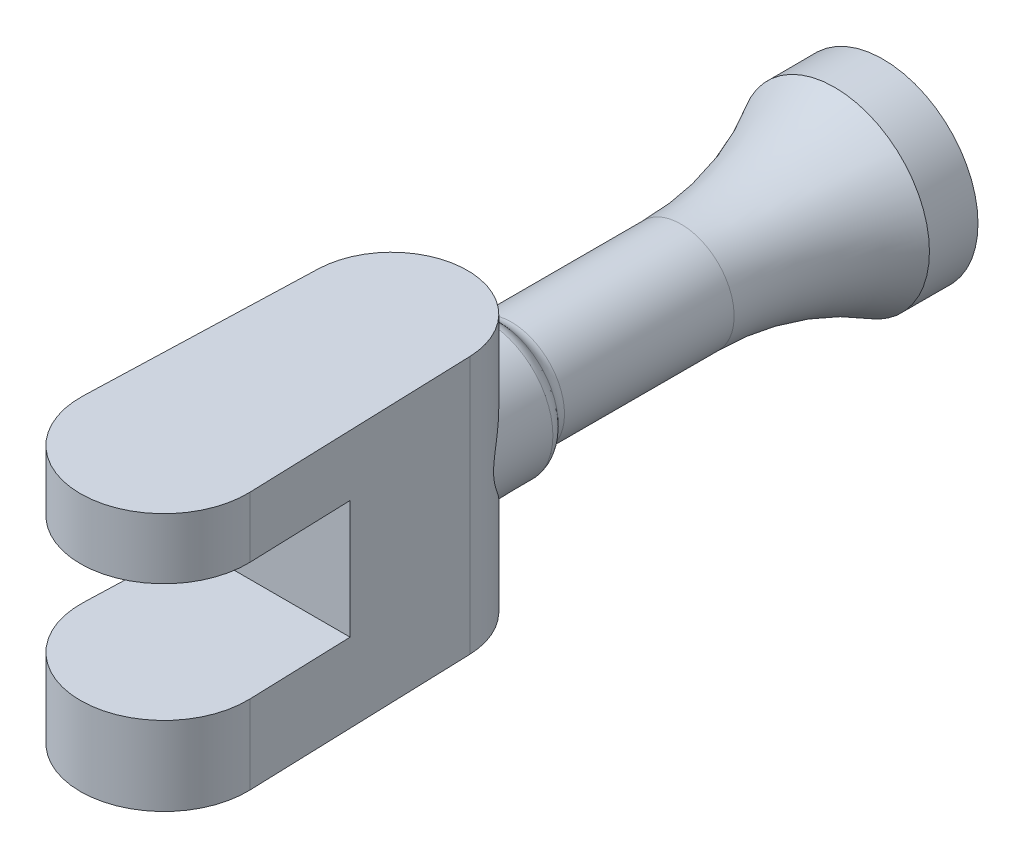
ISO-10303-21;
HEADER;
FILE_DESCRIPTION(('STEP AP214'),'2;1');
FILE_NAME('part.step','',(''),(''),'','','');
FILE_SCHEMA(('AUTOMOTIVE_DESIGN { 1 0 10303 214 1 1 1 1 }'));
ENDSEC;
DATA;
#1=APPLICATION_CONTEXT('core data for automotive mechanical design processes');
#2=APPLICATION_PROTOCOL_DEFINITION('international standard','automotive_design',2000,#1);
#3=PRODUCT_CONTEXT('',#1,'mechanical');
#4=PRODUCT('Part','Part','',(#3));
#5=PRODUCT_RELATED_PRODUCT_CATEGORY('part','',(#4));
#6=PRODUCT_DEFINITION_FORMATION('','',#4);
#7=PRODUCT_DEFINITION_CONTEXT('part definition',#1,'design');
#8=PRODUCT_DEFINITION('design','',#6,#7);
#9=PRODUCT_DEFINITION_SHAPE('','',#8);
#10=(LENGTH_UNIT() NAMED_UNIT(*) SI_UNIT(.MILLI.,.METRE.));
#11=(NAMED_UNIT(*) PLANE_ANGLE_UNIT() SI_UNIT($,.RADIAN.));
#12=(NAMED_UNIT(*) SI_UNIT($,.STERADIAN.) SOLID_ANGLE_UNIT());
#13=UNCERTAINTY_MEASURE_WITH_UNIT(LENGTH_MEASURE(1.E-05),#10,'distance_accuracy_value','');
#14=(GEOMETRIC_REPRESENTATION_CONTEXT(3) GLOBAL_UNCERTAINTY_ASSIGNED_CONTEXT((#13)) GLOBAL_UNIT_ASSIGNED_CONTEXT((#10,
#11,#12)) REPRESENTATION_CONTEXT('',''));
#15=CARTESIAN_POINT('',(0.,0.,0.));
#16=DIRECTION('',(0.,0.,1.));
#17=DIRECTION('',(1.,0.,0.));
#18=AXIS2_PLACEMENT_3D('',#15,#16,#17);
#19=CARTESIAN_POINT('',(0.,79.,474.));
#20=DIRECTION('',(0.,-1.,0.));
#21=DIRECTION('',(0.,0.,-1.));
#22=AXIS2_PLACEMENT_3D('',#19,#20,#21);
#23=CYLINDRICAL_SURFACE('',#22,55.);
#24=DIRECTION('',(0.,-1.,0.));
#25=VECTOR('',#24,1.);
#26=CARTESIAN_POINT('',(54.9694359520715,79.,472.166666666667));
#27=LINE('',#26,#25);
#28=CARTESIAN_POINT('',(54.9694359520715,-39.,472.166666666667));
#29=VERTEX_POINT('',#28);
#30=CARTESIAN_POINT('',(54.9694359520715,-91.,472.166666666667));
#31=VERTEX_POINT('',#30);
#32=EDGE_CURVE('E148',#29,#31,#27,.T.);
#33=ORIENTED_EDGE('',*,*,#32,.F.);
#34=CARTESIAN_POINT('',(0.,-39.,474.));
#35=DIRECTION('',(0.,-1.,0.));
#36=DIRECTION('',(0.,0.,-1.));
#37=AXIS2_PLACEMENT_3D('',#34,#35,#36);
#38=CIRCLE('',#37,55.);
#39=CARTESIAN_POINT('',(-54.9694359520715,-39.,472.166666666667));
#40=VERTEX_POINT('',#39);
#41=EDGE_CURVE('E109',#29,#40,#38,.T.);
#42=ORIENTED_EDGE('',*,*,#41,.T.);
#43=DIRECTION('',(0.,-1.,0.));
#44=VECTOR('',#43,1.);
#45=CARTESIAN_POINT('',(-54.9694359520715,79.,472.166666666667));
#46=LINE('',#45,#44);
#47=CARTESIAN_POINT('',(-54.9694359520715,-91.,472.166666666667));
#48=VERTEX_POINT('',#47);
#49=EDGE_CURVE('E152',#40,#48,#46,.T.);
#50=ORIENTED_EDGE('',*,*,#49,.T.);
#51=CARTESIAN_POINT('',(0.,-91.,474.));
#52=DIRECTION('',(0.,1.,0.));
#53=DIRECTION('',(0.,0.,1.));
#54=AXIS2_PLACEMENT_3D('',#51,#52,#53);
#55=CIRCLE('',#54,55.);
#56=EDGE_CURVE('E133',#48,#31,#55,.T.);
#57=ORIENTED_EDGE('',*,*,#56,.T.);
#58=EDGE_LOOP('',(#33,#42,#50,#57));
#59=FACE_BOUND('',#58,.T.);
#60=ADVANCED_FACE('F32',(#59),#23,.T.);
#61=CARTESIAN_POINT('',(1.11022302462516E-13,0.,266.838213148442));
#62=DIRECTION('',(0.,0.,-1.));
#63=DIRECTION('',(-1.,0.,0.));
#64=AXIS2_PLACEMENT_3D('',#61,#62,#63);
#65=TOROIDAL_SURFACE('',#64,617.119267835692,573.627372225386);
#66=CARTESIAN_POINT('',(0.,0.,261.16));
#67=DIRECTION('',(0.,0.,1.));
#68=DIRECTION('',(1.,0.,0.));
#69=AXIS2_PLACEMENT_3D('',#66,#67,#68);
#70=CIRCLE('',#69,43.52);
#71=CARTESIAN_POINT('',(43.52,0.,261.16));
#72=VERTEX_POINT('',#71);
#73=EDGE_CURVE('E163',#72,#72,#70,.T.);
#74=ORIENTED_EDGE('',*,*,#73,.T.);
#75=EDGE_LOOP('',(#74));
#76=FACE_BOUND('',#75,.T.);
#77=CARTESIAN_POINT('',(-31.4772813356643,-30.434299180226,285.151824242116));
#78=CARTESIAN_POINT('',(-30.673098195026,-31.2360929872093,284.50021634267));
#79=CARTESIAN_POINT('',(-29.8337317977299,-32.0129958438542,283.861479783517));
#80=CARTESIAN_POINT('',(-28.0836932142744,-33.5123703007245,282.618143132112));
#81=CARTESIAN_POINT('',(-27.1730179103238,-34.2348395182718,282.013544534441));
#82=CARTESIAN_POINT('',(-25.2811312214723,-35.6183696170427,280.847966874934));
#83=CARTESIAN_POINT('',(-24.2999776633424,-36.2794798445153,280.286952821671));
#84=CARTESIAN_POINT('',(-22.2676516880738,-37.5331534635026,279.217533750028));
#85=CARTESIAN_POINT('',(-21.2164955240209,-38.1257326795979,278.709116589306));
#86=CARTESIAN_POINT('',(-19.2617488181998,-39.1238802381984,277.849281505185));
#87=CARTESIAN_POINT('',(-18.3700999704709,-39.5432540826555,277.486701507318));
#88=CARTESIAN_POINT('',(-16.5462182032051,-40.3272441296358,276.807104859231));
#89=CARTESIAN_POINT('',(-15.6139895022995,-40.6918660066531,276.490083487462));
#90=CARTESIAN_POINT('',(-13.7132426264031,-41.3611067325228,275.907021911653));
#91=CARTESIAN_POINT('',(-12.7447436049372,-41.6657567338406,275.640955241092));
#92=CARTESIAN_POINT('',(-10.7762212162245,-42.2103873023148,275.164578795654));
#93=CARTESIAN_POINT('',(-9.77619758060166,-42.450367318755,274.954269495595));
#94=CARTESIAN_POINT('',(-7.74430890625304,-42.8627106045592,274.592534007841));
#95=CARTESIAN_POINT('',(-6.71227133746822,-43.0345941783031,274.441525620042));
#96=CARTESIAN_POINT('',(-4.63121564318174,-43.3048777914535,274.203930935176));
#97=CARTESIAN_POINT('',(-3.58219746984117,-43.4032776237998,274.117344819635));
#98=CARTESIAN_POINT('',(-1.47675956819256,-43.5244542375279,274.010702391766));
#99=CARTESIAN_POINT('',(-0.420342380003164,-43.5472558084907,273.990624270666));
#100=CARTESIAN_POINT('',(1.69048461466628,-43.5167908644136,274.017442360982));
#101=CARTESIAN_POINT('',(2.74489457905395,-43.4635306036295,274.064333065824));
#102=CARTESIAN_POINT('',(4.72772105519029,-43.2920498577013,274.215192450733));
#103=CARTESIAN_POINT('',(5.65734100511452,-43.1815445935406,274.312380966135));
#104=CARTESIAN_POINT('',(7.50109438224239,-42.9029934211022,274.557121314046));
#105=CARTESIAN_POINT('',(8.41522917299141,-42.734952607048,274.704668687756));
#106=CARTESIAN_POINT('',(10.222605336706,-42.3439440600802,275.047526629423));
#107=CARTESIAN_POINT('',(11.1158439423905,-42.1209690968232,275.242843484696));
#108=CARTESIAN_POINT('',(12.8766684448862,-41.6233066034576,275.678016895272));
#109=CARTESIAN_POINT('',(13.7442527880082,-41.3486159487035,275.917876141799));
#110=CARTESIAN_POINT('',(15.4901481843561,-40.7369958582096,276.450792349223));
#111=CARTESIAN_POINT('',(16.3670409952745,-40.3977449607306,276.745822304327));
#112=CARTESIAN_POINT('',(18.0852770080933,-39.670651512951,277.37639659601));
#113=CARTESIAN_POINT('',(18.9266201246002,-39.2828088459374,277.711941029902));
#114=CARTESIAN_POINT('',(20.5715053463441,-38.4626658311708,278.419141025658));
#115=CARTESIAN_POINT('',(21.3750473171476,-38.0303653253284,278.790796715932));
#116=CARTESIAN_POINT('',(22.9430744415797,-37.1250923280473,279.56599894692));
#117=CARTESIAN_POINT('',(23.707551192969,-36.6521111451194,279.969552301119));
#118=CARTESIAN_POINT('',(25.0235596896058,-35.7832650774669,280.707380464439));
#119=CARTESIAN_POINT('',(25.5833241910964,-35.3949903257437,281.035987667917));
#120=CARTESIAN_POINT('',(26.6789827174729,-34.5981291463342,281.707626784925));
#121=CARTESIAN_POINT('',(27.214880571544,-34.189545999365,282.050656367223));
#122=CARTESIAN_POINT('',(28.7874513918919,-32.934705158992,283.099266043263));
#123=CARTESIAN_POINT('',(29.7886634714309,-32.0595808105138,283.824175478184));
#124=CARTESIAN_POINT('',(31.221070022279,-30.6944734122479,284.940894336682));
#125=CARTESIAN_POINT('',(31.6878495536864,-30.2297005424946,285.31882614655));
#126=CARTESIAN_POINT('',(32.5977984980625,-29.2837670666457,286.082509017785));
#127=CARTESIAN_POINT('',(33.0409702238649,-28.8026080734818,286.468259308053));
#128=CARTESIAN_POINT('',(33.9037920329491,-27.8246214959342,287.245814658867));
#129=CARTESIAN_POINT('',(34.3234465078128,-27.3277968641922,287.637618571418));
#130=CARTESIAN_POINT('',(35.1394916857828,-26.3188228800905,288.425602118412));
#131=CARTESIAN_POINT('',(35.535883804857,-25.8066744633529,288.821781484775));
#132=CARTESIAN_POINT('',(36.3155005033122,-24.7538273690155,289.62695126729));
#133=CARTESIAN_POINT('',(36.698121604918,-24.2127330074272,290.036008518207));
#134=CARTESIAN_POINT('',(37.4391553619509,-23.1145848126973,290.854646648591));
#135=CARTESIAN_POINT('',(37.7975676923516,-22.5575307654242,291.264227535014));
#136=CARTESIAN_POINT('',(38.4904277921559,-21.4267521392448,292.081756770722));
#137=CARTESIAN_POINT('',(38.8248575374917,-20.8530154683731,292.489703679043));
#138=CARTESIAN_POINT('',(39.4693002557065,-19.6886746655564,293.300772488431));
#139=CARTESIAN_POINT('',(39.7793138772889,-19.0980709823137,293.703894517446));
#140=CARTESIAN_POINT('',(40.3733672624294,-17.9014783000075,294.500221755861));
#141=CARTESIAN_POINT('',(40.6575080723512,-17.2955621058929,294.893460781368));
#142=CARTESIAN_POINT('',(41.2006520191415,-16.0646402898246,295.667513926895));
#143=CARTESIAN_POINT('',(41.4596520149067,-15.439632295326,296.048326490412));
#144=CARTESIAN_POINT('',(41.9511217659615,-14.1698254834343,296.791517438298));
#145=CARTESIAN_POINT('',(42.1836287148711,-13.525056065167,297.153921260206));
#146=CARTESIAN_POINT('',(42.6209483435106,-12.213133617786,297.853780144972));
#147=CARTESIAN_POINT('',(42.8257715720157,-11.5459892362028,298.191244688504));
#148=CARTESIAN_POINT('',(43.1672992973192,-10.3241710063863,298.767621758652));
#149=CARTESIAN_POINT('',(43.3094130550892,-9.77392602232613,299.0126897118));
#150=CARTESIAN_POINT('',(43.5730990276924,-8.65708870292131,299.475401675346));
#151=CARTESIAN_POINT('',(43.6946714893249,-8.09049656407997,299.693046015225));
#152=CARTESIAN_POINT('',(43.9150999918766,-6.94245189261145,300.093595451882));
#153=CARTESIAN_POINT('',(44.0140156172282,-6.36104291296072,300.276591443919));
#154=CARTESIAN_POINT('',(44.187383160053,-5.18310475181638,300.601086312139));
#155=CARTESIAN_POINT('',(44.2618404849945,-4.58657894394882,300.742594360117));
#156=CARTESIAN_POINT('',(44.3746362467544,-3.47507529109483,300.958643142482));
#157=CARTESIAN_POINT('',(44.4167919663696,-2.96185045542218,301.040177705991));
#158=CARTESIAN_POINT('',(44.4810676891277,-1.92950484940287,301.164947593066));
#159=CARTESIAN_POINT('',(44.5031903075606,-1.4103848576216,301.208187915868));
#160=CARTESIAN_POINT('',(44.5267611870873,-0.370039609600018,301.254270024375));
#161=CARTESIAN_POINT('',(44.5282164769686,0.15118487059458,301.257125544614));
#162=CARTESIAN_POINT('',(44.510427239834,1.19192979489986,301.222330466211));
#163=CARTESIAN_POINT('',(44.4911817299358,1.71145015692351,301.18467794423));
#164=CARTESIAN_POINT('',(44.4326871685778,2.7426401113692,301.07097223187));
#165=CARTESIAN_POINT('',(44.3935305219845,3.25433482144037,300.995096445465));
#166=CARTESIAN_POINT('',(44.2962757269853,4.26940087265482,300.808385638698));
#167=CARTESIAN_POINT('',(44.2381770697706,4.77277198983315,300.697549679258));
#168=CARTESIAN_POINT('',(44.1041973640128,5.76996006322128,300.4449548778));
#169=CARTESIAN_POINT('',(44.0282915102942,6.26376264224983,300.303152919806));
#170=CARTESIAN_POINT('',(43.8600402373541,7.24008662661253,299.993166481359));
#171=CARTESIAN_POINT('',(43.7676933235421,7.72260700181159,299.824979602525));
#172=CARTESIAN_POINT('',(43.4730129903088,9.12802082468692,299.296639686953));
#173=CARTESIAN_POINT('',(43.2493826493792,10.0349071751665,298.905609566618));
#174=CARTESIAN_POINT('',(42.7513923315878,11.8074079495879,298.066293236205));
#175=CARTESIAN_POINT('',(42.4769841709576,12.6729821822415,297.617952769558));
#176=CARTESIAN_POINT('',(41.8808748941766,14.3703486828892,296.681473481297));
#177=CARTESIAN_POINT('',(41.558980779644,15.2019845197978,296.193176049304));
#178=CARTESIAN_POINT('',(40.8716392128055,16.8315269336548,295.192400985715));
#179=CARTESIAN_POINT('',(40.5062019467711,17.6294413402927,294.67992902627));
#180=CARTESIAN_POINT('',(39.7899529867722,19.0800203086979,293.716913273865));
#181=CARTESIAN_POINT('',(39.4448600517453,19.736821391111,293.268313275916));
#182=CARTESIAN_POINT('',(38.7244489158548,21.0296788050015,292.365356580278));
#183=CARTESIAN_POINT('',(38.349127383496,21.6657328390626,291.910999252737));
#184=CARTESIAN_POINT('',(37.5682508226468,22.9181620175147,291.00020227532));
#185=CARTESIAN_POINT('',(37.1626782764225,23.5345254597845,290.543761564884));
#186=CARTESIAN_POINT('',(36.3214816126313,24.7474791065772,289.632361773557));
#187=CARTESIAN_POINT('',(35.8858587014467,25.34407010345,289.177402633956));
#188=CARTESIAN_POINT('',(34.9851746345174,26.5163823361664,288.272638932035));
#189=CARTESIAN_POINT('',(34.5201663347024,27.0921382700081,287.822826741953));
#190=CARTESIAN_POINT('',(33.5597753897193,28.2234294651739,286.930183321226));
#191=CARTESIAN_POINT('',(33.0643918774412,28.7789641485274,286.487352290323));
#192=CARTESIAN_POINT('',(32.0432604120653,29.868705688487,285.611438143973));
#193=CARTESIAN_POINT('',(31.5175293519685,30.4029241359696,285.178349788335));
#194=CARTESIAN_POINT('',(30.4352136143476,31.4492279656318,284.324149366388));
#195=CARTESIAN_POINT('',(29.8786283295356,31.9613129118157,283.903037536054));
#196=CARTESIAN_POINT('',(28.4833470840454,33.1814863309631,282.893664223179));
#197=CARTESIAN_POINT('',(27.6279820816431,33.8770390546997,282.313094685869));
#198=CARTESIAN_POINT('',(25.8527725619595,35.214200110476,281.189515515652));
#199=CARTESIAN_POINT('',(24.9329306299156,35.8558106030924,280.646504378553));
#200=CARTESIAN_POINT('',(23.0305951328353,37.0779608781697,279.606699676751));
#201=CARTESIAN_POINT('',(22.0481833674689,37.658577869979,279.109847775296));
#202=CARTESIAN_POINT('',(20.0217505859047,38.7521868736917,278.170139783029));
#203=CARTESIAN_POINT('',(18.9777414204215,39.2651918324453,277.727273355904));
#204=CARTESIAN_POINT('',(17.0277636370403,40.1287710420935,276.97938607472));
#205=CARTESIAN_POINT('',(16.1313375847112,40.4919064011417,276.663955001475));
#206=CARTESIAN_POINT('',(14.3032069923671,41.1629199409217,276.079871988786));
#207=CARTESIAN_POINT('',(13.371506186839,41.4708039513341,275.811215114191));
#208=CARTESIAN_POINT('',(11.4776601038372,42.0266922969059,275.325381399275));
#209=CARTESIAN_POINT('',(10.5155273400984,42.2747208918922,275.108183702835));
#210=CARTESIAN_POINT('',(8.56621251327812,42.706944150868,274.72926129696));
#211=CARTESIAN_POINT('',(7.57903020414642,42.8911381875793,274.567537132643));
#212=CARTESIAN_POINT('',(5.5813045901629,43.1931130069784,274.302217153898));
#213=CARTESIAN_POINT('',(4.57066486645956,43.3105348431234,274.198935522646));
#214=CARTESIAN_POINT('',(2.53924422410677,43.4751107993068,274.05413874666));
#215=CARTESIAN_POINT('',(1.51846329424569,43.5222648416518,274.012623670218));
#216=CARTESIAN_POINT('',(-0.524372185210006,43.5453322780836,273.992317537454));
#217=CARTESIAN_POINT('',(-1.54642651927811,43.5212564255111,274.013517013325));
#218=CARTESIAN_POINT('',(-3.58315861895797,43.4023817511614,274.118132863535));
#219=CARTESIAN_POINT('',(-4.59783671327332,43.3075861005849,274.201546448085));
#220=CARTESIAN_POINT('',(-6.52627553474158,43.0601401363393,274.419072426945));
#221=CARTESIAN_POINT('',(-7.44131501039521,42.9130592917373,274.548301770116));
#222=CARTESIAN_POINT('',(-9.25243922737842,42.5636250744519,274.85495097392));
#223=CARTESIAN_POINT('',(-10.1485256651753,42.3612766714632,275.032366501612));
#224=CARTESIAN_POINT('',(-11.9170302842373,41.904238397043,275.432453995273));
#225=CARTESIAN_POINT('',(-12.7894444208636,41.6495396440105,275.655133640543));
#226=CARTESIAN_POINT('',(-14.5065028965213,41.0912002942247,276.142313066149));
#227=CARTESIAN_POINT('',(-15.3511431501427,40.7875525357289,276.406818965989));
#228=CARTESIAN_POINT('',(-17.2736285335093,40.0309079103659,277.064339568691));
#229=CARTESIAN_POINT('',(-18.3400954476753,39.5611419828649,277.47145595421));
#230=CARTESIAN_POINT('',(-20.4142832221686,38.55087311594,278.343414364085));
#231=CARTESIAN_POINT('',(-21.4219884896039,38.01035152327,278.80827160895));
#232=CARTESIAN_POINT('',(-23.3773049947903,36.865316614756,279.788018701454));
#233=CARTESIAN_POINT('',(-24.32481191319,36.2606968118802,280.30299168671));
#234=CARTESIAN_POINT('',(-26.1564683238656,34.9951170682753,281.374124060846));
#235=CARTESIAN_POINT('',(-27.0406163045352,34.3341557841842,281.930284431723));
#236=CARTESIAN_POINT('',(-29.0224818372173,32.7385204949447,283.262470603698));
#237=CARTESIAN_POINT('',(-30.0963197776731,31.7846614252742,284.051246811924));
#238=CARTESIAN_POINT('',(-31.6241038752109,30.2951336361152,285.265775897221));
#239=CARTESIAN_POINT('',(-32.1196871040057,29.7886566854545,285.67598771967));
#240=CARTESIAN_POINT('',(-33.0835179006074,28.7568820939345,286.504871839825));
#241=CARTESIAN_POINT('',(-33.5517660864649,28.2315848790387,286.923543945954));
#242=CARTESIAN_POINT('',(-34.4613795771919,27.1625749581565,287.76743875643));
#243=CARTESIAN_POINT('',(-34.9027283050912,26.618851211479,288.192665301774));
#244=CARTESIAN_POINT('',(-35.7584670281913,25.5136660129422,289.047208397663));
#245=CARTESIAN_POINT('',(-36.1728563499579,24.952204118512,289.47652505007));
#246=CARTESIAN_POINT('',(-36.9746464698596,23.8118999081826,290.336651946364));
#247=CARTESIAN_POINT('',(-37.3620579812515,23.2330646236849,290.767461525215));
#248=CARTESIAN_POINT('',(-38.1100827117418,22.0576415887265,291.627996107409));
#249=CARTESIAN_POINT('',(-38.4706977796505,21.4610550669903,292.057721183597));
#250=CARTESIAN_POINT('',(-39.2561596028234,20.0905810415057,293.025219536909));
#251=CARTESIAN_POINT('',(-39.6730428769133,19.3112341409435,293.561767587248));
#252=CARTESIAN_POINT('',(-40.4633058161013,17.7211937856688,294.620462325879));
#253=CARTESIAN_POINT('',(-40.8366822283016,16.9104979931067,295.142607935111));
#254=CARTESIAN_POINT('',(-41.5378633941472,15.2556518058775,296.161411285939));
#255=CARTESIAN_POINT('',(-41.8657352882883,14.4115531129832,296.65810588166));
#256=CARTESIAN_POINT('',(-42.3214788297348,13.1166747430377,297.373457659371));
#257=CARTESIAN_POINT('',(-42.4673581906357,12.6803463639655,297.606918116217));
#258=CARTESIAN_POINT('',(-42.7466149078829,11.7973105134011,298.061649754156));
#259=CARTESIAN_POINT('',(-42.8799900131115,11.3506011910416,298.282918737496));
#260=CARTESIAN_POINT('',(-43.1602405276992,10.3510372119376,298.755512867356));
#261=CARTESIAN_POINT('',(-43.3040392444741,9.79564933282674,299.003347595223));
#262=CARTESIAN_POINT('',(-43.5706619708067,8.66841784184962,299.471039952496));
#263=CARTESIAN_POINT('',(-43.6934932577588,8.09658002029687,299.690907282073));
#264=CARTESIAN_POINT('',(-43.9160906138614,6.9373453732052,300.095393276387));
#265=CARTESIAN_POINT('',(-44.0159018681257,6.34998159437763,300.280080867753));
#266=CARTESIAN_POINT('',(-44.1905392979149,5.15985648150381,300.607036215149));
#267=CARTESIAN_POINT('',(-44.2653717225739,4.55709903928479,300.749314580046));
#268=CARTESIAN_POINT('',(-44.3778400452457,3.43876029553567,300.964818556938));
#269=CARTESIAN_POINT('',(-44.41955703207,2.92503785758305,301.045530688742));
#270=CARTESIAN_POINT('',(-44.4829092416846,1.89176621698263,301.16853816839));
#271=CARTESIAN_POINT('',(-44.5045470035963,1.37221775947682,301.210838373608));
#272=CARTESIAN_POINT('',(-44.5271102224971,0.331267698641873,301.254954577771));
#273=CARTESIAN_POINT('',(-44.5280489576186,-0.190132502077121,301.25679653011));
#274=CARTESIAN_POINT('',(-44.5092201098597,-1.23112745235769,301.219970752918));
#275=CARTESIAN_POINT('',(-44.4894515722054,-1.750722117561,301.181301155474));
#276=CARTESIAN_POINT('',(-44.4299240682479,-2.78192518250632,301.065615490183));
#277=CARTESIAN_POINT('',(-44.390259230999,-3.29355959937954,300.988780001047));
#278=CARTESIAN_POINT('',(-44.2920092063086,-4.30843979261195,300.80023359054));
#279=CARTESIAN_POINT('',(-44.2334234792397,-4.81168532928815,300.68852167449));
#280=CARTESIAN_POINT('',(-44.098476745986,-5.808710880097,300.434240753809));
#281=CARTESIAN_POINT('',(-44.0220863319504,-6.30247375523222,300.291620726167));
#282=CARTESIAN_POINT('',(-43.8528833385501,-7.27868905389143,299.980088863772));
#283=CARTESIAN_POINT('',(-43.7600693376374,-7.76114049425408,299.811174753281));
#284=CARTESIAN_POINT('',(-43.4633390100072,-9.1696385190434,299.279574417936));
#285=CARTESIAN_POINT('',(-43.2379414868863,-10.0795069003099,298.885836817695));
#286=CARTESIAN_POINT('',(-42.7361049683987,-11.8577232938686,298.041045624759));
#287=CARTESIAN_POINT('',(-42.4596165242005,-12.7260300464101,297.589936637629));
#288=CARTESIAN_POINT('',(-41.8592759024151,-14.4280006721898,296.648326178387));
#289=CARTESIAN_POINT('',(-41.5352657616622,-15.2615366126396,296.157695888672));
#290=CARTESIAN_POINT('',(-40.8434697116345,-16.8947233973735,295.152411343339));
#291=CARTESIAN_POINT('',(-40.4756962674185,-17.6943838028169,294.637763953752));
#292=CARTESIAN_POINT('',(-39.811539077756,-19.0338289576738,293.746837871467));
#293=CARTESIAN_POINT('',(-39.5257109432222,-19.5812521953628,293.374085702246));
#294=CARTESIAN_POINT('',(-38.9331008828232,-20.6616128866355,292.624181686043));
#295=CARTESIAN_POINT('',(-38.6263178342456,-21.1945495619233,292.247029604225));
#296=CARTESIAN_POINT('',(-37.9918776658343,-22.2465449986244,291.490601015594));
#297=CARTESIAN_POINT('',(-37.6642152558866,-22.7656001952748,291.111323992773));
#298=CARTESIAN_POINT('',(-36.9880896768229,-23.7900075273564,290.352720552726));
#299=CARTESIAN_POINT('',(-36.6396251577321,-24.2953587703534,289.973394133892));
#300=CARTESIAN_POINT('',(-35.9223191970919,-25.2917608894849,289.216982760455));
#301=CARTESIAN_POINT('',(-35.5535047259911,-25.7828294358563,288.839895539417));
#302=CARTESIAN_POINT('',(-34.7949843199172,-26.7512238248369,288.089083017417));
#303=CARTESIAN_POINT('',(-34.4052769973285,-27.2285487514083,287.715357941685));
#304=CARTESIAN_POINT('',(-33.2047779235881,-28.6392973080981,286.60168864211));
#305=CARTESIAN_POINT('',(-32.3623373829453,-29.5518727506196,285.868961275607));
#306=CARTESIAN_POINT('',(-31.4772813356643,-30.434299180226,285.151824242116));
#307=B_SPLINE_CURVE_WITH_KNOTS('',3,(#77,#78,#79,#80,#81,#82,#83,#84,#85,#86,#87,#88,#89,#90,
#91,#92,#93,#94,#95,#96,#97,#98,#99,#100,#101,#102,#103,#104,#105,#106,#107,#108,#109,#110,#111,
#112,#113,#114,#115,#116,#117,#118,#119,#120,#121,#122,#123,#124,#125,#126,#127,#128,#129,#130,
#131,#132,#133,#134,#135,#136,#137,#138,#139,#140,#141,#142,#143,#144,#145,#146,#147,#148,#149,
#150,#151,#152,#153,#154,#155,#156,#157,#158,#159,#160,#161,#162,#163,#164,#165,#166,#167,#168,
#169,#170,#171,#172,#173,#174,#175,#176,#177,#178,#179,#180,#181,#182,#183,#184,#185,#186,#187,
#188,#189,#190,#191,#192,#193,#194,#195,#196,#197,#198,#199,#200,#201,#202,#203,#204,#205,#206,
#207,#208,#209,#210,#211,#212,#213,#214,#215,#216,#217,#218,#219,#220,#221,#222,#223,#224,#225,
#226,#227,#228,#229,#230,#231,#232,#233,#234,#235,#236,#237,#238,#239,#240,#241,#242,#243,#244,
#245,#246,#247,#248,#249,#250,#251,#252,#253,#254,#255,#256,#257,#258,#259,#260,#261,#262,#263,
#264,#265,#266,#267,#268,#269,#270,#271,#272,#273,#274,#275,#276,#277,#278,#279,#280,#281,#282,
#283,#284,#285,#286,#287,#288,#289,#290,#291,#292,#293,#294,#295,#296,#297,#298,#299,#300,#301,
#302,#303,#304,#305,#306),.UNSPECIFIED.,.T.,.F.,(4,2,2,2,2,2,2,2,2,2,2,2,2,2,2,2,2,2,2,2,2,2,2,
2,2,2,2,2,2,2,2,2,2,2,2,2,2,2,2,2,2,2,2,2,2,2,2,2,2,2,2,2,2,2,2,2,2,2,2,2,2,2,2,2,2,2,2,2,2,2,2,
2,2,2,2,2,2,2,2,2,2,2,2,2,2,2,2,2,2,2,2,2,2,2,2,2,2,2,2,2,2,2,2,2,2,2,2,2,2,2,2,2,2,2,4),(0.,
3.92684716038685,7.85386610762622,11.7776989861312,15.7006239907605,18.8475380261679,
21.9941256899493,25.1390745166328,28.2840501242015,31.4508020835244,34.6175629659898,
37.7832853266382,40.9487473977655,43.7691008754588,46.5892047023321,49.4096799051788,
52.2303255749638,55.1837764724937,58.1372344640793,61.0907029583432,64.044804040671,
66.3130688392343,68.5809683946861,73.118109756446,75.395976635081,77.6736199413436,
79.9508364962729,82.2279142940967,84.5637339804023,86.8995850211352,89.2371735574745,
91.5746999662836,93.902665969568,96.2309224564744,98.5558689445328,100.879927007914,
102.73562624593,104.591303186528,106.442042432968,108.292372224953,109.85480543384,
111.417034640108,112.978732532413,114.54050457804,116.095093916331,117.649725016493,
119.206534691393,120.763485961917,123.795894547269,126.831195521436,129.879191365447,
132.926475571,135.526729925129,138.127271246597,140.729330357088,143.331285067731,
145.928685945318,148.526161004506,151.122203863755,153.718297837735,157.452968241038,
161.187488986274,164.917223885787,168.646243547297,171.695286227325,174.744007007343,
177.791490035912,180.839003010108,183.902747245793,186.966494868983,190.029779991964,
193.092927760086,195.897078449343,198.700977070519,201.505351785841,204.310137183031,
208.007986830832,211.706813309813,215.411883951411,219.117042958521,224.025368300154,
226.481161329641,228.936898811652,231.394134667205,233.851431879881,236.307747634773,
238.763893759453,241.864300200695,244.96493830293,248.060951735792,249.608367093308,
251.156060496312,253.029856048374,254.902999913557,256.772435158771,258.641402362733,
260.204808732371,261.768017374263,263.330223210768,264.892501080868,266.447456582421,
268.002456435518,269.56004310114,271.117764650108,274.162470449358,277.210138679327,
280.268177201603,283.32534678132,285.488894667807,287.652558562895,289.816772852837,
291.981127744749,294.142680005552,296.304376005859,300.626127669653),.UNSPECIFIED.);
#308=CARTESIAN_POINT('',(-31.4772813356643,-30.434299180226,285.151824242116));
#309=VERTEX_POINT('',#308);
#310=EDGE_CURVE('E173',#309,#309,#307,.T.);
#311=ORIENTED_EDGE('',*,*,#310,.F.);
#312=EDGE_LOOP('',(#311));
#313=FACE_BOUND('',#312,.T.);
#314=ADVANCED_FACE('F183',(#76,#313),#65,.F.);
#315=CARTESIAN_POINT('',(0.,0.,32.));
#316=DIRECTION('',(0.,0.,-1.));
#317=DIRECTION('',(-1.,0.,0.));
#318=AXIS2_PLACEMENT_3D('',#315,#316,#317);
#319=CYLINDRICAL_SURFACE('',#318,62.5);
#320=CARTESIAN_POINT('',(0.,0.,32.));
#321=DIRECTION('',(0.,0.,1.));
#322=DIRECTION('',(1.,0.,0.));
#323=AXIS2_PLACEMENT_3D('',#320,#321,#322);
#324=CIRCLE('',#323,62.5);
#325=CARTESIAN_POINT('',(62.5,0.,32.));
#326=VERTEX_POINT('',#325);
#327=EDGE_CURVE('E170',#326,#326,#324,.T.);
#328=ORIENTED_EDGE('',*,*,#327,.F.);
#329=EDGE_LOOP('',(#328));
#330=FACE_BOUND('',#329,.T.);
#331=CARTESIAN_POINT('',(0.,0.,0.));
#332=DIRECTION('',(0.,0.,1.));
#333=DIRECTION('',(1.,0.,0.));
#334=AXIS2_PLACEMENT_3D('',#331,#332,#333);
#335=CIRCLE('',#334,62.5);
#336=CARTESIAN_POINT('',(62.5,0.,0.));
#337=VERTEX_POINT('',#336);
#338=EDGE_CURVE('E169',#337,#337,#335,.T.);
#339=ORIENTED_EDGE('',*,*,#338,.T.);
#340=EDGE_LOOP('',(#339));
#341=FACE_BOUND('',#340,.T.);
#342=ADVANCED_FACE('F34',(#330,#341),#319,.T.);
#343=CARTESIAN_POINT('',(0.,0.,0.));
#344=DIRECTION('',(0.,0.,1.));
#345=DIRECTION('',(1.,0.,0.));
#346=AXIS2_PLACEMENT_3D('',#343,#344,#345);
#347=PLANE('',#346);
#348=ORIENTED_EDGE('',*,*,#338,.F.);
#349=EDGE_LOOP('',(#348));
#350=FACE_BOUND('',#349,.T.);
#351=ADVANCED_FACE('F239',(#350),#347,.F.);
#352=CARTESIAN_POINT('',(0.,0.,133.211));
#353=DIRECTION('',(0.,0.,-1.));
#354=DIRECTION('',(-1.,0.,0.));
#355=AXIS2_PLACEMENT_3D('',#352,#353,#354);
#356=TOROIDAL_SURFACE('',#355,234.9984822,199.9984822);
#357=ORIENTED_EDGE('',*,*,#327,.T.);
#358=EDGE_LOOP('',(#357));
#359=FACE_BOUND('',#358,.T.);
#360=CARTESIAN_POINT('',(0.,0.,133.211));
#361=DIRECTION('',(0.,0.,-1.));
#362=DIRECTION('',(-1.,0.,0.));
#363=AXIS2_PLACEMENT_3D('',#360,#361,#362);
#364=CIRCLE('',#363,35.);
#365=CARTESIAN_POINT('',(-35.,0.,133.211));
#366=VERTEX_POINT('',#365);
#367=EDGE_CURVE('E166',#366,#366,#364,.T.);
#368=ORIENTED_EDGE('',*,*,#367,.T.);
#369=EDGE_LOOP('',(#368));
#370=FACE_BOUND('',#369,.T.);
#371=ADVANCED_FACE('F253',(#359,#370),#356,.F.);
#372=CARTESIAN_POINT('',(0.,0.,32.));
#373=DIRECTION('',(0.,0.,-1.));
#374=DIRECTION('',(-1.,0.,0.));
#375=AXIS2_PLACEMENT_3D('',#372,#373,#374);
#376=CYLINDRICAL_SURFACE('',#375,35.);
#377=ORIENTED_EDGE('',*,*,#367,.F.);
#378=EDGE_LOOP('',(#377));
#379=FACE_BOUND('',#378,.T.);
#380=CARTESIAN_POINT('',(0.,0.,245.));
#381=DIRECTION('',(0.,0.,1.));
#382=DIRECTION('',(1.,0.,0.));
#383=AXIS2_PLACEMENT_3D('',#380,#381,#382);
#384=CIRCLE('',#383,35.);
#385=CARTESIAN_POINT('',(35.,0.,245.));
#386=VERTEX_POINT('',#385);
#387=EDGE_CURVE('E160',#386,#386,#384,.T.);
#388=ORIENTED_EDGE('',*,*,#387,.F.);
#389=EDGE_LOOP('',(#388));
#390=FACE_BOUND('',#389,.T.);
#391=ADVANCED_FACE('F245',(#379,#390),#376,.T.);
#392=CARTESIAN_POINT('',(0.,0.,263.132271416127));
#393=DIRECTION('',(0.,0.,1.));
#394=DIRECTION('',(1.,0.,0.));
#395=AXIS2_PLACEMENT_3D('',#392,#393,#394);
#396=TOROIDAL_SURFACE('',#395,30.7580800195696,12.9134215499139);
#397=CARTESIAN_POINT('',(0.,0.,253.08));
#398=DIRECTION('',(0.,0.,1.));
#399=DIRECTION('',(1.,0.,0.));
#400=AXIS2_PLACEMENT_3D('',#397,#398,#399);
#401=CIRCLE('',#400,38.8641453722731);
#402=CARTESIAN_POINT('',(38.8641453722731,0.,253.08));
#403=VERTEX_POINT('',#402);
#404=EDGE_CURVE('E157',#403,#403,#401,.T.);
#405=ORIENTED_EDGE('',*,*,#404,.T.);
#406=EDGE_LOOP('',(#405));
#407=FACE_BOUND('',#406,.T.);
#408=ORIENTED_EDGE('',*,*,#73,.F.);
#409=EDGE_LOOP('',(#408));
#410=FACE_BOUND('',#409,.T.);
#411=ADVANCED_FACE('F243',(#407,#410),#396,.T.);
#412=CARTESIAN_POINT('',(0.,0.,245.));
#413=DIRECTION('',(0.,0.,1.));
#414=DIRECTION('',(1.,0.,0.));
#415=AXIS2_PLACEMENT_3D('',#412,#413,#414);
#416=TOROIDAL_SURFACE('',#415,45.3797879905941,10.379787990594);
#417=ORIENTED_EDGE('',*,*,#387,.T.);
#418=EDGE_LOOP('',(#417));
#419=FACE_BOUND('',#418,.T.);
#420=ORIENTED_EDGE('',*,*,#404,.F.);
#421=EDGE_LOOP('',(#420));
#422=FACE_BOUND('',#421,.T.);
#423=ADVANCED_FACE('F190',(#419,#422),#416,.F.);
#424=CARTESIAN_POINT('',(0.,79.,324.));
#425=DIRECTION('',(0.,-1.,0.));
#426=DIRECTION('',(0.,0.,-1.));
#427=AXIS2_PLACEMENT_3D('',#424,#425,#426);
#428=CYLINDRICAL_SURFACE('',#427,50.);
#429=DIRECTION('',(0.,-1.,0.));
#430=VECTOR('',#429,1.);
#431=CARTESIAN_POINT('',(49.9722145018832,79.,322.333333333333));
#432=LINE('',#431,#430);
#433=CARTESIAN_POINT('',(49.9722145018832,79.,322.333333333333));
#434=VERTEX_POINT('',#433);
#435=CARTESIAN_POINT('',(49.9722145018832,-91.,322.333333333333));
#436=VERTEX_POINT('',#435);
#437=EDGE_CURVE('E146',#434,#436,#432,.T.);
#438=ORIENTED_EDGE('',*,*,#437,.T.);
#439=CARTESIAN_POINT('',(0.,-91.,324.));
#440=DIRECTION('',(0.,1.,0.));
#441=DIRECTION('',(0.,0.,1.));
#442=AXIS2_PLACEMENT_3D('',#439,#440,#441);
#443=CIRCLE('',#442,50.);
#444=CARTESIAN_POINT('',(-49.9722145018832,-91.,322.333333333333));
#445=VERTEX_POINT('',#444);
#446=EDGE_CURVE('E127',#436,#445,#443,.T.);
#447=ORIENTED_EDGE('',*,*,#446,.T.);
#448=DIRECTION('',(0.,-1.,0.));
#449=VECTOR('',#448,1.);
#450=CARTESIAN_POINT('',(-49.9722145018832,79.,322.333333333333));
#451=LINE('',#450,#449);
#452=CARTESIAN_POINT('',(-49.9722145018832,79.,322.333333333333));
#453=VERTEX_POINT('',#452);
#454=EDGE_CURVE('E155',#453,#445,#451,.T.);
#455=ORIENTED_EDGE('',*,*,#454,.F.);
#456=CARTESIAN_POINT('',(0.,79.,324.));
#457=DIRECTION('',(0.,1.,0.));
#458=DIRECTION('',(0.,0.,1.));
#459=AXIS2_PLACEMENT_3D('',#456,#457,#458);
#460=CIRCLE('',#459,50.);
#461=EDGE_CURVE('E139',#434,#453,#460,.T.);
#462=ORIENTED_EDGE('',*,*,#461,.F.);
#463=EDGE_LOOP('',(#438,#447,#455,#462));
#464=FACE_BOUND('',#463,.T.);
#465=ORIENTED_EDGE('',*,*,#310,.T.);
#466=EDGE_LOOP('',(#465));
#467=FACE_BOUND('',#466,.T.);
#468=ADVANCED_FACE('F186',(#464,#467),#428,.T.);
#469=CARTESIAN_POINT('',(-49.9722145018832,79.,322.333333333333));
#470=DIRECTION('',(0.999444290037663,0.,0.0333333333333331));
#471=DIRECTION('',(0.0333333333333331,0.,-0.999444290037663));
#472=AXIS2_PLACEMENT_3D('',#469,#470,#471);
#473=PLANE('',#472);
#474=ORIENTED_EDGE('',*,*,#49,.F.);
#475=DIRECTION('',(0.0333333333333331,0.,-0.999444290037663));
#476=VECTOR('',#475,1.);
#477=CARTESIAN_POINT('',(-49.9722145018832,-39.,322.333333333333));
#478=LINE('',#477,#476);
#479=CARTESIAN_POINT('',(-52.6959503312405,-39.,404.));
#480=VERTEX_POINT('',#479);
#481=EDGE_CURVE('E119',#40,#480,#478,.T.);
#482=ORIENTED_EDGE('',*,*,#481,.T.);
#483=DIRECTION('',(0.,1.,0.));
#484=VECTOR('',#483,1.);
#485=CARTESIAN_POINT('',(-52.6959503312405,79.,404.));
#486=LINE('',#485,#484);
#487=CARTESIAN_POINT('',(-52.6959503312405,39.,404.));
#488=VERTEX_POINT('',#487);
#489=EDGE_CURVE('E112',#480,#488,#486,.T.);
#490=ORIENTED_EDGE('',*,*,#489,.T.);
#491=DIRECTION('',(-0.0333333333333331,0.,0.999444290037663));
#492=VECTOR('',#491,1.);
#493=CARTESIAN_POINT('',(-49.9722145018832,39.,322.333333333333));
#494=LINE('',#493,#492);
#495=CARTESIAN_POINT('',(-54.9694359520715,39.,472.166666666667));
#496=VERTEX_POINT('',#495);
#497=EDGE_CURVE('E98',#488,#496,#494,.T.);
#498=ORIENTED_EDGE('',*,*,#497,.T.);
#499=CARTESIAN_POINT('',(-54.9694359520715,79.,472.166666666667));
#500=VERTEX_POINT('',#499);
#501=EDGE_CURVE('E153',#500,#496,#46,.T.);
#502=ORIENTED_EDGE('',*,*,#501,.F.);
#503=DIRECTION('',(-0.0333333333333331,0.,0.999444290037663));
#504=VECTOR('',#503,1.);
#505=CARTESIAN_POINT('',(-49.9722145018832,79.,322.333333333333));
#506=LINE('',#505,#504);
#507=EDGE_CURVE('E141',#453,#500,#506,.T.);
#508=ORIENTED_EDGE('',*,*,#507,.F.);
#509=ORIENTED_EDGE('',*,*,#454,.T.);
#510=DIRECTION('',(-0.0333333333333331,0.,0.999444290037663));
#511=VECTOR('',#510,1.);
#512=CARTESIAN_POINT('',(-49.9722145018832,-91.,322.333333333333));
#513=LINE('',#512,#511);
#514=EDGE_CURVE('E130',#445,#48,#513,.T.);
#515=ORIENTED_EDGE('',*,*,#514,.T.);
#516=EDGE_LOOP('',(#474,#482,#490,#498,#502,#508,#509,#515));
#517=FACE_BOUND('',#516,.T.);
#518=ADVANCED_FACE('F118',(#517),#473,.F.);
#519=CARTESIAN_POINT('',(0.,39.,474.));
#520=DIRECTION('',(0.,1.,0.));
#521=DIRECTION('',(0.,0.,1.));
#522=AXIS2_PLACEMENT_3D('',#519,#520,#521);
#523=CIRCLE('',#522,55.);
#524=CARTESIAN_POINT('',(54.9694359520715,39.,472.166666666667));
#525=VERTEX_POINT('',#524);
#526=EDGE_CURVE('E104',#496,#525,#523,.T.);
#527=ORIENTED_EDGE('',*,*,#526,.T.);
#528=CARTESIAN_POINT('',(54.9694359520715,79.,472.166666666667));
#529=VERTEX_POINT('',#528);
#530=EDGE_CURVE('E149',#529,#525,#27,.T.);
#531=ORIENTED_EDGE('',*,*,#530,.F.);
#532=CARTESIAN_POINT('',(0.,79.,474.));
#533=DIRECTION('',(0.,1.,0.));
#534=DIRECTION('',(0.,0.,1.));
#535=AXIS2_PLACEMENT_3D('',#532,#533,#534);
#536=CIRCLE('',#535,55.);
#537=EDGE_CURVE('E143',#500,#529,#536,.T.);
#538=ORIENTED_EDGE('',*,*,#537,.F.);
#539=ORIENTED_EDGE('',*,*,#501,.T.);
#540=EDGE_LOOP('',(#527,#531,#538,#539));
#541=FACE_BOUND('',#540,.T.);
#542=ADVANCED_FACE('F194',(#541),#23,.T.);
#543=CARTESIAN_POINT('',(49.9722145018832,79.,322.333333333333));
#544=DIRECTION('',(-0.999444290037663,0.,0.0333333333333335));
#545=DIRECTION('',(0.0333333333333335,0.,0.999444290037663));
#546=AXIS2_PLACEMENT_3D('',#543,#544,#545);
#547=PLANE('',#546);
#548=DIRECTION('',(0.,-1.,0.));
#549=VECTOR('',#548,1.);
#550=CARTESIAN_POINT('',(52.6959503312405,79.,404.));
#551=LINE('',#550,#549);
#552=CARTESIAN_POINT('',(52.6959503312406,39.,404.));
#553=VERTEX_POINT('',#552);
#554=CARTESIAN_POINT('',(52.6959503312405,-39.,404.));
#555=VERTEX_POINT('',#554);
#556=EDGE_CURVE('E114',#553,#555,#551,.T.);
#557=ORIENTED_EDGE('',*,*,#556,.T.);
#558=DIRECTION('',(0.0333333333333335,0.,0.999444290037663));
#559=VECTOR('',#558,1.);
#560=CARTESIAN_POINT('',(49.9722145018832,-39.,322.333333333333));
#561=LINE('',#560,#559);
#562=EDGE_CURVE('E11',#555,#29,#561,.T.);
#563=ORIENTED_EDGE('',*,*,#562,.T.);
#564=ORIENTED_EDGE('',*,*,#32,.T.);
#565=DIRECTION('',(-0.0333333333333335,0.,-0.999444290037663));
#566=VECTOR('',#565,1.);
#567=CARTESIAN_POINT('',(49.9722145018832,-91.,322.333333333333));
#568=LINE('',#567,#566);
#569=EDGE_CURVE('E136',#31,#436,#568,.T.);
#570=ORIENTED_EDGE('',*,*,#569,.T.);
#571=ORIENTED_EDGE('',*,*,#437,.F.);
#572=DIRECTION('',(-0.0333333333333335,0.,-0.999444290037663));
#573=VECTOR('',#572,1.);
#574=CARTESIAN_POINT('',(49.9722145018832,79.,322.333333333333));
#575=LINE('',#574,#573);
#576=EDGE_CURVE('E55',#529,#434,#575,.T.);
#577=ORIENTED_EDGE('',*,*,#576,.F.);
#578=ORIENTED_EDGE('',*,*,#530,.T.);
#579=DIRECTION('',(-0.0333333333333335,0.,-0.999444290037663));
#580=VECTOR('',#579,1.);
#581=CARTESIAN_POINT('',(49.9722145018832,39.,322.333333333333));
#582=LINE('',#581,#580);
#583=EDGE_CURVE('E40',#525,#553,#582,.T.);
#584=ORIENTED_EDGE('',*,*,#583,.T.);
#585=EDGE_LOOP('',(#557,#563,#564,#570,#571,#577,#578,#584));
#586=FACE_BOUND('',#585,.T.);
#587=ADVANCED_FACE('F197',(#586),#547,.F.);
#588=CARTESIAN_POINT('',(0.,79.,324.));
#589=DIRECTION('',(0.,1.,0.));
#590=DIRECTION('',(0.,0.,1.));
#591=AXIS2_PLACEMENT_3D('',#588,#589,#590);
#592=PLANE('',#591);
#593=ORIENTED_EDGE('',*,*,#461,.T.);
#594=ORIENTED_EDGE('',*,*,#507,.T.);
#595=ORIENTED_EDGE('',*,*,#537,.T.);
#596=ORIENTED_EDGE('',*,*,#576,.T.);
#597=EDGE_LOOP('',(#593,#594,#595,#596));
#598=FACE_BOUND('',#597,.T.);
#599=ADVANCED_FACE('F201',(#598),#592,.T.);
#600=CARTESIAN_POINT('',(0.,-91.,324.));
#601=DIRECTION('',(0.,1.,0.));
#602=DIRECTION('',(0.,0.,1.));
#603=AXIS2_PLACEMENT_3D('',#600,#601,#602);
#604=PLANE('',#603);
#605=ORIENTED_EDGE('',*,*,#446,.F.);
#606=ORIENTED_EDGE('',*,*,#569,.F.);
#607=ORIENTED_EDGE('',*,*,#56,.F.);
#608=ORIENTED_EDGE('',*,*,#514,.F.);
#609=EDGE_LOOP('',(#605,#606,#607,#608));
#610=FACE_BOUND('',#609,.T.);
#611=ADVANCED_FACE('F205',(#610),#604,.F.);
#612=CARTESIAN_POINT('',(-62.5,-39.,529.));
#613=DIRECTION('',(0.,-1.,0.));
#614=DIRECTION('',(0.,0.,-1.));
#615=AXIS2_PLACEMENT_3D('',#612,#613,#614);
#616=PLANE('',#615);
#617=ORIENTED_EDGE('',*,*,#41,.F.);
#618=ORIENTED_EDGE('',*,*,#562,.F.);
#619=DIRECTION('',(1.,0.,0.));
#620=VECTOR('',#619,1.);
#621=CARTESIAN_POINT('',(-62.5,-39.,404.));
#622=LINE('',#621,#620);
#623=EDGE_CURVE('E47',#480,#555,#622,.T.);
#624=ORIENTED_EDGE('',*,*,#623,.F.);
#625=ORIENTED_EDGE('',*,*,#481,.F.);
#626=EDGE_LOOP('',(#617,#618,#624,#625));
#627=FACE_BOUND('',#626,.T.);
#628=ADVANCED_FACE('F208',(#627),#616,.F.);
#629=CARTESIAN_POINT('',(-62.5,39.,529.));
#630=DIRECTION('',(0.,1.,0.));
#631=DIRECTION('',(0.,0.,1.));
#632=AXIS2_PLACEMENT_3D('',#629,#630,#631);
#633=PLANE('',#632);
#634=DIRECTION('',(1.,0.,0.));
#635=VECTOR('',#634,1.);
#636=CARTESIAN_POINT('',(-62.5,39.,404.));
#637=LINE('',#636,#635);
#638=EDGE_CURVE('E102',#488,#553,#637,.T.);
#639=ORIENTED_EDGE('',*,*,#638,.T.);
#640=ORIENTED_EDGE('',*,*,#583,.F.);
#641=ORIENTED_EDGE('',*,*,#526,.F.);
#642=ORIENTED_EDGE('',*,*,#497,.F.);
#643=EDGE_LOOP('',(#639,#640,#641,#642));
#644=FACE_BOUND('',#643,.T.);
#645=ADVANCED_FACE('F100',(#644),#633,.F.);
#646=CARTESIAN_POINT('',(-62.5,-39.,404.));
#647=DIRECTION('',(0.,0.,-1.));
#648=DIRECTION('',(-1.,0.,0.));
#649=AXIS2_PLACEMENT_3D('',#646,#647,#648);
#650=PLANE('',#649);
#651=ORIENTED_EDGE('',*,*,#623,.T.);
#652=ORIENTED_EDGE('',*,*,#556,.F.);
#653=ORIENTED_EDGE('',*,*,#638,.F.);
#654=ORIENTED_EDGE('',*,*,#489,.F.);
#655=EDGE_LOOP('',(#651,#652,#653,#654));
#656=FACE_BOUND('',#655,.T.);
#657=ADVANCED_FACE('F111',(#656),#650,.F.);
#658=CLOSED_SHELL('',(#60,#314,#342,#351,#371,#391,#411,#423,#468,#518,#542,#587,#599,#611,#628,
#645,#657));
#659=MANIFOLD_SOLID_BREP('B2',#658);
#660=ADVANCED_BREP_SHAPE_REPRESENTATION('',(#18,#659),#14);
#661=SHAPE_DEFINITION_REPRESENTATION(#9,#660);
ENDSEC;
END-ISO-10303-21;
